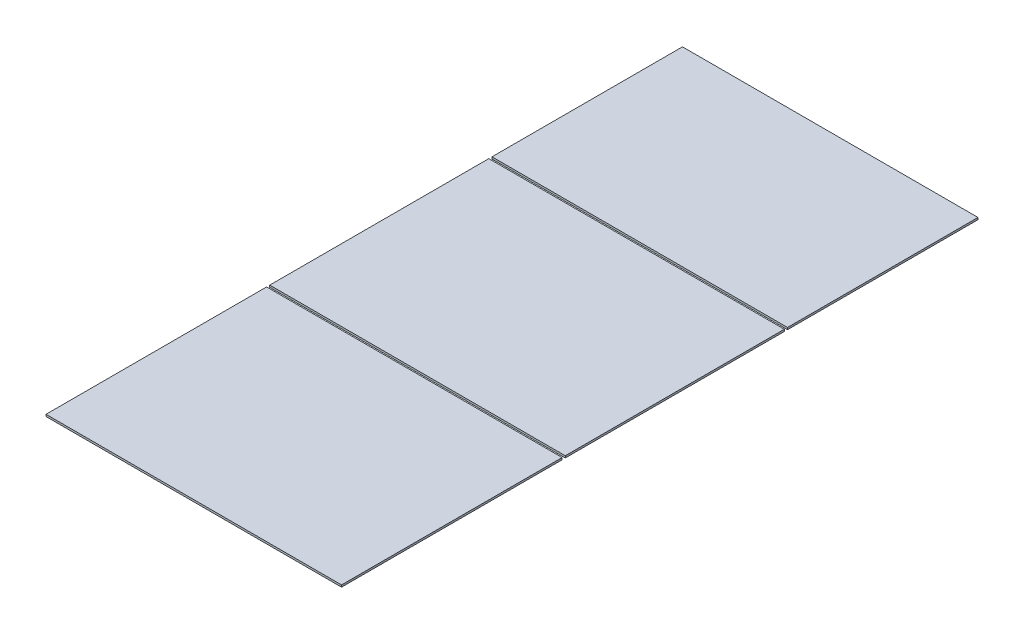
ISO-10303-21;
HEADER;
FILE_DESCRIPTION(('STEP AP214'),'2;1');
FILE_NAME('part.step','',(''),(''),'','','');
FILE_SCHEMA(('AUTOMOTIVE_DESIGN { 1 0 10303 214 1 1 1 1 }'));
ENDSEC;
DATA;
#1=APPLICATION_CONTEXT('core data for automotive mechanical design processes');
#2=APPLICATION_PROTOCOL_DEFINITION('international standard','automotive_design',2000,#1);
#3=PRODUCT_CONTEXT('',#1,'mechanical');
#4=PRODUCT('Part','Part','',(#3));
#5=PRODUCT_RELATED_PRODUCT_CATEGORY('part','',(#4));
#6=PRODUCT_DEFINITION_FORMATION('','',#4);
#7=PRODUCT_DEFINITION_CONTEXT('part definition',#1,'design');
#8=PRODUCT_DEFINITION('design','',#6,#7);
#9=PRODUCT_DEFINITION_SHAPE('','',#8);
#10=(LENGTH_UNIT() NAMED_UNIT(*) SI_UNIT(.MILLI.,.METRE.));
#11=(NAMED_UNIT(*) PLANE_ANGLE_UNIT() SI_UNIT($,.RADIAN.));
#12=(NAMED_UNIT(*) SI_UNIT($,.STERADIAN.) SOLID_ANGLE_UNIT());
#13=UNCERTAINTY_MEASURE_WITH_UNIT(LENGTH_MEASURE(1.E-05),#10,'distance_accuracy_value','');
#14=(GEOMETRIC_REPRESENTATION_CONTEXT(3) GLOBAL_UNCERTAINTY_ASSIGNED_CONTEXT((#13)) GLOBAL_UNIT_ASSIGNED_CONTEXT((#10,
#11,#12)) REPRESENTATION_CONTEXT('',''));
#15=CARTESIAN_POINT('',(0.,0.,0.));
#16=DIRECTION('',(0.,0.,1.));
#17=DIRECTION('',(1.,0.,0.));
#18=AXIS2_PLACEMENT_3D('',#15,#16,#17);
#19=CARTESIAN_POINT('',(0.,-2.5,0.));
#20=DIRECTION('',(0.,1.,0.));
#21=DIRECTION('',(0.,0.,1.));
#22=AXIS2_PLACEMENT_3D('',#19,#20,#21);
#23=PLANE('',#22);
#24=DIRECTION('',(0.,0.,1.));
#25=VECTOR('',#24,1.);
#26=CARTESIAN_POINT('',(-374.3,-2.49999999999995,-315.532));
#27=LINE('',#26,#25);
#28=CARTESIAN_POINT('',(-374.3,-2.49999999999995,-315.532));
#29=VERTEX_POINT('',#28);
#30=CARTESIAN_POINT('',(-374.3,-2.49999999999995,239.331999999998));
#31=VERTEX_POINT('',#30);
#32=EDGE_CURVE('E106',#29,#31,#27,.T.);
#33=ORIENTED_EDGE('',*,*,#32,.F.);
#34=DIRECTION('',(-1.,0.,0.));
#35=VECTOR('',#34,1.);
#36=CARTESIAN_POINT('',(-374.3,-2.49999999999995,-315.532));
#37=LINE('',#36,#35);
#38=CARTESIAN_POINT('',(374.3,-2.49999999999995,-315.532));
#39=VERTEX_POINT('',#38);
#40=EDGE_CURVE('E98',#39,#29,#37,.T.);
#41=ORIENTED_EDGE('',*,*,#40,.F.);
#42=DIRECTION('',(0.,0.,-1.));
#43=VECTOR('',#42,1.);
#44=CARTESIAN_POINT('',(374.3,-2.49999999999995,-315.532));
#45=LINE('',#44,#43);
#46=CARTESIAN_POINT('',(374.3,-2.49999999999995,239.331999999998));
#47=VERTEX_POINT('',#46);
#48=EDGE_CURVE('E84',#47,#39,#45,.T.);
#49=ORIENTED_EDGE('',*,*,#48,.F.);
#50=DIRECTION('',(1.,0.,0.));
#51=VECTOR('',#50,1.);
#52=CARTESIAN_POINT('',(-374.3,-2.49999999999995,239.331999999998));
#53=LINE('',#52,#51);
#54=EDGE_CURVE('E95',#31,#47,#53,.T.);
#55=ORIENTED_EDGE('',*,*,#54,.F.);
#56=EDGE_LOOP('',(#33,#41,#49,#55));
#57=FACE_BOUND('',#56,.T.);
#58=ADVANCED_FACE('F44',(#57),#23,.F.);
#59=CARTESIAN_POINT('',(-374.3,936.643264078911,-315.532));
#60=DIRECTION('',(1.,0.,0.));
#61=DIRECTION('',(0.,0.,-1.));
#62=AXIS2_PLACEMENT_3D('',#59,#60,#61);
#63=PLANE('',#62);
#64=DIRECTION('',(0.,-1.,0.));
#65=VECTOR('',#64,1.);
#66=CARTESIAN_POINT('',(-374.3,936.643264078911,239.331999999998));
#67=LINE('',#66,#65);
#68=CARTESIAN_POINT('',(-374.3,2.49999999999995,239.331999999998));
#69=VERTEX_POINT('',#68);
#70=EDGE_CURVE('E101',#69,#31,#67,.T.);
#71=ORIENTED_EDGE('',*,*,#70,.F.);
#72=DIRECTION('',(0.,0.,-1.));
#73=VECTOR('',#72,1.);
#74=CARTESIAN_POINT('',(-374.3,2.49999999999995,-315.532));
#75=LINE('',#74,#73);
#76=CARTESIAN_POINT('',(-374.3,2.49999999999995,-315.532));
#77=VERTEX_POINT('',#76);
#78=EDGE_CURVE('E60',#69,#77,#75,.T.);
#79=ORIENTED_EDGE('',*,*,#78,.T.);
#80=DIRECTION('',(0.,-1.,0.));
#81=VECTOR('',#80,1.);
#82=CARTESIAN_POINT('',(-374.3,936.643264078911,-315.532));
#83=LINE('',#82,#81);
#84=EDGE_CURVE('E103',#77,#29,#83,.T.);
#85=ORIENTED_EDGE('',*,*,#84,.T.);
#86=ORIENTED_EDGE('',*,*,#32,.T.);
#87=EDGE_LOOP('',(#71,#79,#85,#86));
#88=FACE_BOUND('',#87,.T.);
#89=ADVANCED_FACE('F118',(#88),#63,.F.);
#90=CARTESIAN_POINT('',(-374.3,936.643264078911,239.331999999998));
#91=DIRECTION('',(0.,0.,-1.));
#92=DIRECTION('',(-1.,0.,0.));
#93=AXIS2_PLACEMENT_3D('',#90,#91,#92);
#94=PLANE('',#93);
#95=DIRECTION('',(0.,-1.,0.));
#96=VECTOR('',#95,1.);
#97=CARTESIAN_POINT('',(374.3,936.643264078911,239.331999999998));
#98=LINE('',#97,#96);
#99=CARTESIAN_POINT('',(374.3,2.49999999999995,239.331999999998));
#100=VERTEX_POINT('',#99);
#101=EDGE_CURVE('E80',#100,#47,#98,.T.);
#102=ORIENTED_EDGE('',*,*,#101,.F.);
#103=DIRECTION('',(-1.,0.,0.));
#104=VECTOR('',#103,1.);
#105=CARTESIAN_POINT('',(-374.3,2.49999999999995,239.331999999998));
#106=LINE('',#105,#104);
#107=EDGE_CURVE('E109',#100,#69,#106,.T.);
#108=ORIENTED_EDGE('',*,*,#107,.T.);
#109=ORIENTED_EDGE('',*,*,#70,.T.);
#110=ORIENTED_EDGE('',*,*,#54,.T.);
#111=EDGE_LOOP('',(#102,#108,#109,#110));
#112=FACE_BOUND('',#111,.T.);
#113=ADVANCED_FACE('F100',(#112),#94,.F.);
#114=CARTESIAN_POINT('',(374.3,936.643264078911,-315.532));
#115=DIRECTION('',(-1.,0.,0.));
#116=DIRECTION('',(0.,0.,1.));
#117=AXIS2_PLACEMENT_3D('',#114,#115,#116);
#118=PLANE('',#117);
#119=DIRECTION('',(0.,-1.,0.));
#120=VECTOR('',#119,1.);
#121=CARTESIAN_POINT('',(374.3,936.643264078911,-315.532));
#122=LINE('',#121,#120);
#123=CARTESIAN_POINT('',(374.3,2.49999999999995,-315.532));
#124=VERTEX_POINT('',#123);
#125=EDGE_CURVE('E12',#124,#39,#122,.T.);
#126=ORIENTED_EDGE('',*,*,#125,.F.);
#127=DIRECTION('',(0.,0.,1.));
#128=VECTOR('',#127,1.);
#129=CARTESIAN_POINT('',(374.3,2.49999999999995,-315.532));
#130=LINE('',#129,#128);
#131=EDGE_CURVE('E86',#124,#100,#130,.T.);
#132=ORIENTED_EDGE('',*,*,#131,.T.);
#133=ORIENTED_EDGE('',*,*,#101,.T.);
#134=ORIENTED_EDGE('',*,*,#48,.T.);
#135=EDGE_LOOP('',(#126,#132,#133,#134));
#136=FACE_BOUND('',#135,.T.);
#137=ADVANCED_FACE('F83',(#136),#118,.F.);
#138=CARTESIAN_POINT('',(-374.3,936.643264078911,-315.532));
#139=DIRECTION('',(0.,0.,1.));
#140=DIRECTION('',(1.,0.,0.));
#141=AXIS2_PLACEMENT_3D('',#138,#139,#140);
#142=PLANE('',#141);
#143=ORIENTED_EDGE('',*,*,#84,.F.);
#144=DIRECTION('',(1.,0.,0.));
#145=VECTOR('',#144,1.);
#146=CARTESIAN_POINT('',(-374.3,2.49999999999995,-315.532));
#147=LINE('',#146,#145);
#148=EDGE_CURVE('E47',#77,#124,#147,.T.);
#149=ORIENTED_EDGE('',*,*,#148,.T.);
#150=ORIENTED_EDGE('',*,*,#125,.T.);
#151=ORIENTED_EDGE('',*,*,#40,.T.);
#152=EDGE_LOOP('',(#143,#149,#150,#151));
#153=FACE_BOUND('',#152,.T.);
#154=ADVANCED_FACE('F116',(#153),#142,.F.);
#155=CARTESIAN_POINT('',(0.,2.5,0.));
#156=DIRECTION('',(0.,1.,0.));
#157=DIRECTION('',(0.,0.,1.));
#158=AXIS2_PLACEMENT_3D('',#155,#156,#157);
#159=PLANE('',#158);
#160=ORIENTED_EDGE('',*,*,#107,.F.);
#161=ORIENTED_EDGE('',*,*,#131,.F.);
#162=ORIENTED_EDGE('',*,*,#148,.F.);
#163=ORIENTED_EDGE('',*,*,#78,.F.);
#164=EDGE_LOOP('',(#160,#161,#162,#163));
#165=FACE_BOUND('',#164,.T.);
#166=ADVANCED_FACE('F112',(#165),#159,.T.);
#167=CLOSED_SHELL('',(#58,#89,#113,#137,#154,#166));
#168=MANIFOLD_SOLID_BREP('B2',#167);
#169=CARTESIAN_POINT('',(0.,-2.5,0.));
#170=DIRECTION('',(0.,-1.,0.));
#171=DIRECTION('',(0.,0.,-1.));
#172=AXIS2_PLACEMENT_3D('',#169,#170,#171);
#173=PLANE('',#172);
#174=DIRECTION('',(0.,0.,-1.));
#175=VECTOR('',#174,1.);
#176=CARTESIAN_POINT('',(374.3,-2.49999999999995,806.099999999999));
#177=LINE('',#176,#175);
#178=CARTESIAN_POINT('',(374.3,-2.49999999999995,806.099999999999));
#179=VERTEX_POINT('',#178);
#180=CARTESIAN_POINT('',(374.3,-2.49999999999995,247.331999999998));
#181=VERTEX_POINT('',#180);
#182=EDGE_CURVE('E245',#179,#181,#177,.T.);
#183=ORIENTED_EDGE('',*,*,#182,.F.);
#184=DIRECTION('',(1.,0.,0.));
#185=VECTOR('',#184,1.);
#186=CARTESIAN_POINT('',(374.3,-2.49999999999995,806.099999999999));
#187=LINE('',#186,#185);
#188=CARTESIAN_POINT('',(-374.3,-2.49999999999995,806.099999999999));
#189=VERTEX_POINT('',#188);
#190=EDGE_CURVE('E237',#189,#179,#187,.T.);
#191=ORIENTED_EDGE('',*,*,#190,.F.);
#192=DIRECTION('',(0.,0.,1.));
#193=VECTOR('',#192,1.);
#194=CARTESIAN_POINT('',(-374.3,-2.49999999999995,806.099999999999));
#195=LINE('',#194,#193);
#196=CARTESIAN_POINT('',(-374.3,-2.49999999999995,247.331999999998));
#197=VERTEX_POINT('',#196);
#198=EDGE_CURVE('E223',#197,#189,#195,.T.);
#199=ORIENTED_EDGE('',*,*,#198,.F.);
#200=DIRECTION('',(-1.,0.,0.));
#201=VECTOR('',#200,1.);
#202=CARTESIAN_POINT('',(374.3,-2.49999999999995,247.331999999998));
#203=LINE('',#202,#201);
#204=EDGE_CURVE('E234',#181,#197,#203,.T.);
#205=ORIENTED_EDGE('',*,*,#204,.F.);
#206=EDGE_LOOP('',(#183,#191,#199,#205));
#207=FACE_BOUND('',#206,.T.);
#208=ADVANCED_FACE('F183',(#207),#173,.T.);
#209=CARTESIAN_POINT('',(374.3,936.643264078911,806.099999999999));
#210=DIRECTION('',(-1.,0.,0.));
#211=DIRECTION('',(0.,0.,1.));
#212=AXIS2_PLACEMENT_3D('',#209,#210,#211);
#213=PLANE('',#212);
#214=DIRECTION('',(0.,-1.,0.));
#215=VECTOR('',#214,1.);
#216=CARTESIAN_POINT('',(374.3,936.643264078911,247.331999999998));
#217=LINE('',#216,#215);
#218=CARTESIAN_POINT('',(374.3,2.49999999999995,247.331999999998));
#219=VERTEX_POINT('',#218);
#220=EDGE_CURVE('E240',#219,#181,#217,.T.);
#221=ORIENTED_EDGE('',*,*,#220,.F.);
#222=DIRECTION('',(0.,0.,1.));
#223=VECTOR('',#222,1.);
#224=CARTESIAN_POINT('',(374.3,2.49999999999995,806.099999999999));
#225=LINE('',#224,#223);
#226=CARTESIAN_POINT('',(374.3,2.49999999999995,806.099999999999));
#227=VERTEX_POINT('',#226);
#228=EDGE_CURVE('E199',#219,#227,#225,.T.);
#229=ORIENTED_EDGE('',*,*,#228,.T.);
#230=DIRECTION('',(0.,-1.,0.));
#231=VECTOR('',#230,1.);
#232=CARTESIAN_POINT('',(374.3,936.643264078911,806.099999999999));
#233=LINE('',#232,#231);
#234=EDGE_CURVE('E242',#227,#179,#233,.T.);
#235=ORIENTED_EDGE('',*,*,#234,.T.);
#236=ORIENTED_EDGE('',*,*,#182,.T.);
#237=EDGE_LOOP('',(#221,#229,#235,#236));
#238=FACE_BOUND('',#237,.T.);
#239=ADVANCED_FACE('F257',(#238),#213,.F.);
#240=CARTESIAN_POINT('',(374.3,936.643264078911,247.331999999998));
#241=DIRECTION('',(0.,0.,1.));
#242=DIRECTION('',(1.,0.,0.));
#243=AXIS2_PLACEMENT_3D('',#240,#241,#242);
#244=PLANE('',#243);
#245=DIRECTION('',(0.,-1.,0.));
#246=VECTOR('',#245,1.);
#247=CARTESIAN_POINT('',(-374.3,936.643264078911,247.331999999998));
#248=LINE('',#247,#246);
#249=CARTESIAN_POINT('',(-374.3,2.49999999999995,247.331999999998));
#250=VERTEX_POINT('',#249);
#251=EDGE_CURVE('E219',#250,#197,#248,.T.);
#252=ORIENTED_EDGE('',*,*,#251,.F.);
#253=DIRECTION('',(1.,0.,0.));
#254=VECTOR('',#253,1.);
#255=CARTESIAN_POINT('',(374.3,2.49999999999995,247.331999999998));
#256=LINE('',#255,#254);
#257=EDGE_CURVE('E248',#250,#219,#256,.T.);
#258=ORIENTED_EDGE('',*,*,#257,.T.);
#259=ORIENTED_EDGE('',*,*,#220,.T.);
#260=ORIENTED_EDGE('',*,*,#204,.T.);
#261=EDGE_LOOP('',(#252,#258,#259,#260));
#262=FACE_BOUND('',#261,.T.);
#263=ADVANCED_FACE('F239',(#262),#244,.F.);
#264=CARTESIAN_POINT('',(-374.3,936.643264078911,806.099999999999));
#265=DIRECTION('',(1.,0.,0.));
#266=DIRECTION('',(0.,0.,-1.));
#267=AXIS2_PLACEMENT_3D('',#264,#265,#266);
#268=PLANE('',#267);
#269=DIRECTION('',(0.,-1.,0.));
#270=VECTOR('',#269,1.);
#271=CARTESIAN_POINT('',(-374.3,936.643264078911,806.099999999999));
#272=LINE('',#271,#270);
#273=CARTESIAN_POINT('',(-374.3,2.49999999999995,806.099999999999));
#274=VERTEX_POINT('',#273);
#275=EDGE_CURVE('E42',#274,#189,#272,.T.);
#276=ORIENTED_EDGE('',*,*,#275,.F.);
#277=DIRECTION('',(0.,0.,-1.));
#278=VECTOR('',#277,1.);
#279=CARTESIAN_POINT('',(-374.3,2.49999999999995,806.099999999999));
#280=LINE('',#279,#278);
#281=EDGE_CURVE('E225',#274,#250,#280,.T.);
#282=ORIENTED_EDGE('',*,*,#281,.T.);
#283=ORIENTED_EDGE('',*,*,#251,.T.);
#284=ORIENTED_EDGE('',*,*,#198,.T.);
#285=EDGE_LOOP('',(#276,#282,#283,#284));
#286=FACE_BOUND('',#285,.T.);
#287=ADVANCED_FACE('F222',(#286),#268,.F.);
#288=CARTESIAN_POINT('',(374.3,936.643264078911,806.099999999999));
#289=DIRECTION('',(0.,0.,-1.));
#290=DIRECTION('',(-1.,0.,0.));
#291=AXIS2_PLACEMENT_3D('',#288,#289,#290);
#292=PLANE('',#291);
#293=ORIENTED_EDGE('',*,*,#234,.F.);
#294=DIRECTION('',(-1.,0.,0.));
#295=VECTOR('',#294,1.);
#296=CARTESIAN_POINT('',(374.3,2.49999999999995,806.099999999999));
#297=LINE('',#296,#295);
#298=EDGE_CURVE('E186',#227,#274,#297,.T.);
#299=ORIENTED_EDGE('',*,*,#298,.T.);
#300=ORIENTED_EDGE('',*,*,#275,.T.);
#301=ORIENTED_EDGE('',*,*,#190,.T.);
#302=EDGE_LOOP('',(#293,#299,#300,#301));
#303=FACE_BOUND('',#302,.T.);
#304=ADVANCED_FACE('F255',(#303),#292,.F.);
#305=CARTESIAN_POINT('',(0.,2.5,0.));
#306=DIRECTION('',(0.,-1.,0.));
#307=DIRECTION('',(0.,0.,-1.));
#308=AXIS2_PLACEMENT_3D('',#305,#306,#307);
#309=PLANE('',#308);
#310=ORIENTED_EDGE('',*,*,#257,.F.);
#311=ORIENTED_EDGE('',*,*,#281,.F.);
#312=ORIENTED_EDGE('',*,*,#298,.F.);
#313=ORIENTED_EDGE('',*,*,#228,.F.);
#314=EDGE_LOOP('',(#310,#311,#312,#313));
#315=FACE_BOUND('',#314,.T.);
#316=ADVANCED_FACE('F251',(#315),#309,.F.);
#317=CLOSED_SHELL('',(#208,#239,#263,#287,#304,#316));
#318=MANIFOLD_SOLID_BREP('B6',#317);
#319=CARTESIAN_POINT('',(0.,-2.5,0.));
#320=DIRECTION('',(0.,-1.,0.));
#321=DIRECTION('',(0.,0.,-1.));
#322=AXIS2_PLACEMENT_3D('',#319,#320,#321);
#323=PLANE('',#322);
#324=DIRECTION('',(0.,0.,1.));
#325=VECTOR('',#324,1.);
#326=CARTESIAN_POINT('',(-374.3,-2.49999999999995,-806.100000000004));
#327=LINE('',#326,#325);
#328=CARTESIAN_POINT('',(-374.3,-2.49999999999995,-806.100000000004));
#329=VERTEX_POINT('',#328);
#330=CARTESIAN_POINT('',(-374.3,-2.49999999999995,-323.532));
#331=VERTEX_POINT('',#330);
#332=EDGE_CURVE('E375',#329,#331,#327,.T.);
#333=ORIENTED_EDGE('',*,*,#332,.F.);
#334=DIRECTION('',(-1.,0.,0.));
#335=VECTOR('',#334,1.);
#336=CARTESIAN_POINT('',(-374.3,-2.49999999999995,-806.100000000004));
#337=LINE('',#336,#335);
#338=CARTESIAN_POINT('',(374.3,-2.49999999999995,-806.100000000004));
#339=VERTEX_POINT('',#338);
#340=EDGE_CURVE('E367',#339,#329,#337,.T.);
#341=ORIENTED_EDGE('',*,*,#340,.F.);
#342=DIRECTION('',(0.,0.,-1.));
#343=VECTOR('',#342,1.);
#344=CARTESIAN_POINT('',(374.3,-2.49999999999995,-806.100000000004));
#345=LINE('',#344,#343);
#346=CARTESIAN_POINT('',(374.3,-2.49999999999995,-323.532));
#347=VERTEX_POINT('',#346);
#348=EDGE_CURVE('E353',#347,#339,#345,.T.);
#349=ORIENTED_EDGE('',*,*,#348,.F.);
#350=DIRECTION('',(1.,0.,0.));
#351=VECTOR('',#350,1.);
#352=CARTESIAN_POINT('',(-374.3,-2.49999999999995,-323.532));
#353=LINE('',#352,#351);
#354=EDGE_CURVE('E364',#331,#347,#353,.T.);
#355=ORIENTED_EDGE('',*,*,#354,.F.);
#356=EDGE_LOOP('',(#333,#341,#349,#355));
#357=FACE_BOUND('',#356,.T.);
#358=ADVANCED_FACE('F313',(#357),#323,.T.);
#359=CARTESIAN_POINT('',(-374.3,936.643264078911,-806.100000000004));
#360=DIRECTION('',(1.,0.,0.));
#361=DIRECTION('',(0.,0.,-1.));
#362=AXIS2_PLACEMENT_3D('',#359,#360,#361);
#363=PLANE('',#362);
#364=DIRECTION('',(0.,-1.,0.));
#365=VECTOR('',#364,1.);
#366=CARTESIAN_POINT('',(-374.3,936.643264078911,-323.532));
#367=LINE('',#366,#365);
#368=CARTESIAN_POINT('',(-374.3,2.49999999999995,-323.532));
#369=VERTEX_POINT('',#368);
#370=EDGE_CURVE('E370',#369,#331,#367,.T.);
#371=ORIENTED_EDGE('',*,*,#370,.F.);
#372=DIRECTION('',(0.,0.,-1.));
#373=VECTOR('',#372,1.);
#374=CARTESIAN_POINT('',(-374.3,2.49999999999995,-806.100000000004));
#375=LINE('',#374,#373);
#376=CARTESIAN_POINT('',(-374.3,2.49999999999995,-806.100000000004));
#377=VERTEX_POINT('',#376);
#378=EDGE_CURVE('E329',#369,#377,#375,.T.);
#379=ORIENTED_EDGE('',*,*,#378,.T.);
#380=DIRECTION('',(0.,-1.,0.));
#381=VECTOR('',#380,1.);
#382=CARTESIAN_POINT('',(-374.3,936.643264078911,-806.100000000004));
#383=LINE('',#382,#381);
#384=EDGE_CURVE('E372',#377,#329,#383,.T.);
#385=ORIENTED_EDGE('',*,*,#384,.T.);
#386=ORIENTED_EDGE('',*,*,#332,.T.);
#387=EDGE_LOOP('',(#371,#379,#385,#386));
#388=FACE_BOUND('',#387,.T.);
#389=ADVANCED_FACE('F387',(#388),#363,.F.);
#390=CARTESIAN_POINT('',(-374.3,936.643264078911,-323.532));
#391=DIRECTION('',(0.,0.,-1.));
#392=DIRECTION('',(-1.,0.,0.));
#393=AXIS2_PLACEMENT_3D('',#390,#391,#392);
#394=PLANE('',#393);
#395=DIRECTION('',(0.,-1.,0.));
#396=VECTOR('',#395,1.);
#397=CARTESIAN_POINT('',(374.3,936.643264078911,-323.532));
#398=LINE('',#397,#396);
#399=CARTESIAN_POINT('',(374.3,2.49999999999995,-323.532));
#400=VERTEX_POINT('',#399);
#401=EDGE_CURVE('E349',#400,#347,#398,.T.);
#402=ORIENTED_EDGE('',*,*,#401,.F.);
#403=DIRECTION('',(-1.,0.,0.));
#404=VECTOR('',#403,1.);
#405=CARTESIAN_POINT('',(-374.3,2.49999999999995,-323.532));
#406=LINE('',#405,#404);
#407=EDGE_CURVE('E378',#400,#369,#406,.T.);
#408=ORIENTED_EDGE('',*,*,#407,.T.);
#409=ORIENTED_EDGE('',*,*,#370,.T.);
#410=ORIENTED_EDGE('',*,*,#354,.T.);
#411=EDGE_LOOP('',(#402,#408,#409,#410));
#412=FACE_BOUND('',#411,.T.);
#413=ADVANCED_FACE('F369',(#412),#394,.F.);
#414=CARTESIAN_POINT('',(374.3,936.643264078911,-806.100000000004));
#415=DIRECTION('',(-1.,0.,0.));
#416=DIRECTION('',(0.,0.,1.));
#417=AXIS2_PLACEMENT_3D('',#414,#415,#416);
#418=PLANE('',#417);
#419=DIRECTION('',(0.,-1.,0.));
#420=VECTOR('',#419,1.);
#421=CARTESIAN_POINT('',(374.3,936.643264078911,-806.100000000004));
#422=LINE('',#421,#420);
#423=CARTESIAN_POINT('',(374.3,2.49999999999995,-806.100000000004));
#424=VERTEX_POINT('',#423);
#425=EDGE_CURVE('E181',#424,#339,#422,.T.);
#426=ORIENTED_EDGE('',*,*,#425,.F.);
#427=DIRECTION('',(0.,0.,1.));
#428=VECTOR('',#427,1.);
#429=CARTESIAN_POINT('',(374.3,2.49999999999995,-806.100000000004));
#430=LINE('',#429,#428);
#431=EDGE_CURVE('E355',#424,#400,#430,.T.);
#432=ORIENTED_EDGE('',*,*,#431,.T.);
#433=ORIENTED_EDGE('',*,*,#401,.T.);
#434=ORIENTED_EDGE('',*,*,#348,.T.);
#435=EDGE_LOOP('',(#426,#432,#433,#434));
#436=FACE_BOUND('',#435,.T.);
#437=ADVANCED_FACE('F352',(#436),#418,.F.);
#438=CARTESIAN_POINT('',(-374.3,936.643264078911,-806.100000000004));
#439=DIRECTION('',(0.,0.,1.));
#440=DIRECTION('',(1.,0.,0.));
#441=AXIS2_PLACEMENT_3D('',#438,#439,#440);
#442=PLANE('',#441);
#443=ORIENTED_EDGE('',*,*,#384,.F.);
#444=DIRECTION('',(1.,0.,0.));
#445=VECTOR('',#444,1.);
#446=CARTESIAN_POINT('',(-374.3,2.49999999999995,-806.100000000004));
#447=LINE('',#446,#445);
#448=EDGE_CURVE('E316',#377,#424,#447,.T.);
#449=ORIENTED_EDGE('',*,*,#448,.T.);
#450=ORIENTED_EDGE('',*,*,#425,.T.);
#451=ORIENTED_EDGE('',*,*,#340,.T.);
#452=EDGE_LOOP('',(#443,#449,#450,#451));
#453=FACE_BOUND('',#452,.T.);
#454=ADVANCED_FACE('F385',(#453),#442,.F.);
#455=CARTESIAN_POINT('',(0.,2.5,0.));
#456=DIRECTION('',(0.,-1.,0.));
#457=DIRECTION('',(0.,0.,-1.));
#458=AXIS2_PLACEMENT_3D('',#455,#456,#457);
#459=PLANE('',#458);
#460=ORIENTED_EDGE('',*,*,#407,.F.);
#461=ORIENTED_EDGE('',*,*,#431,.F.);
#462=ORIENTED_EDGE('',*,*,#448,.F.);
#463=ORIENTED_EDGE('',*,*,#378,.F.);
#464=EDGE_LOOP('',(#460,#461,#462,#463));
#465=FACE_BOUND('',#464,.T.);
#466=ADVANCED_FACE('F381',(#465),#459,.F.);
#467=CLOSED_SHELL('',(#358,#389,#413,#437,#454,#466));
#468=MANIFOLD_SOLID_BREP('B36',#467);
#469=ADVANCED_BREP_SHAPE_REPRESENTATION('',(#18,#168,#318,#468),#14);
#470=SHAPE_DEFINITION_REPRESENTATION(#9,#469);
ENDSEC;
END-ISO-10303-21;
